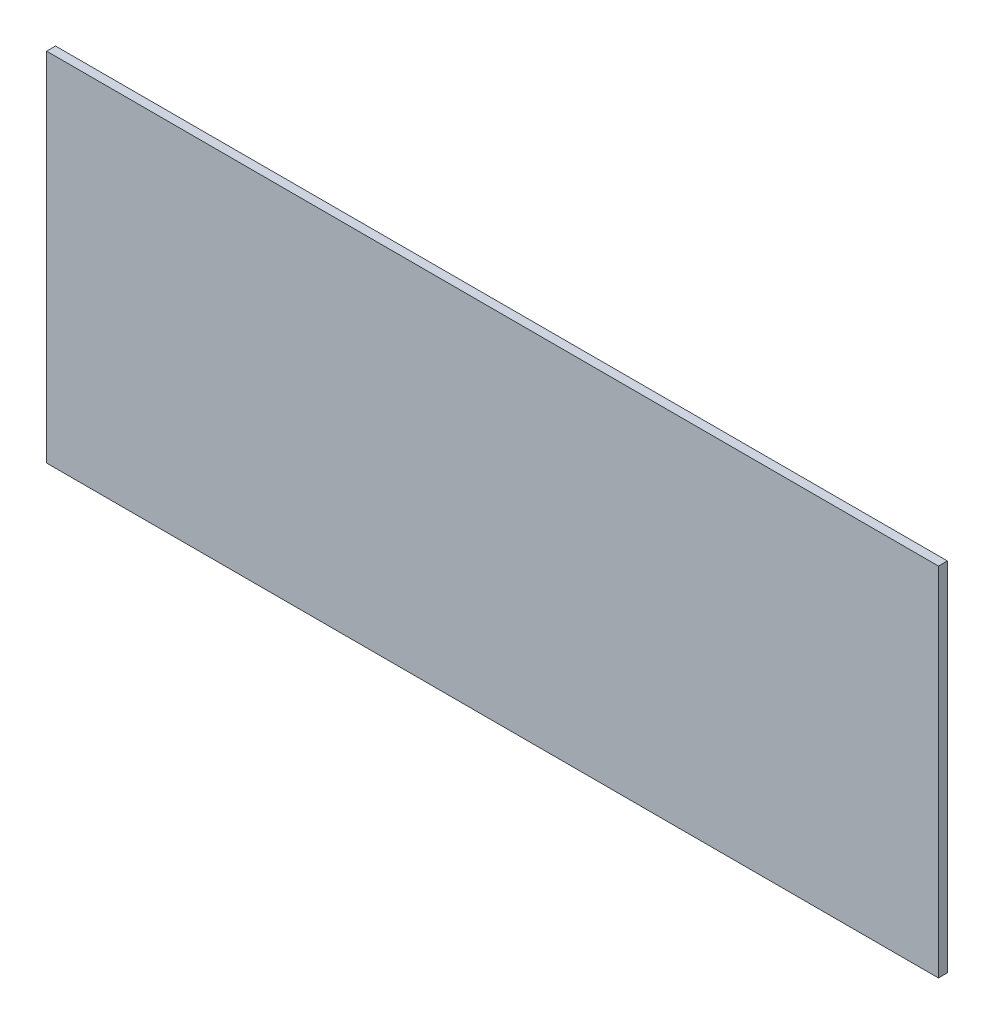
ISO-10303-21;
HEADER;
FILE_DESCRIPTION(('STEP AP214'),'2;1');
FILE_NAME('part.step','',(''),(''),'','','');
FILE_SCHEMA(('AUTOMOTIVE_DESIGN { 1 0 10303 214 1 1 1 1 }'));
ENDSEC;
DATA;
#1=APPLICATION_CONTEXT('core data for automotive mechanical design processes');
#2=APPLICATION_PROTOCOL_DEFINITION('international standard','automotive_design',2000,#1);
#3=PRODUCT_CONTEXT('',#1,'mechanical');
#4=PRODUCT('Part','Part','',(#3));
#5=PRODUCT_RELATED_PRODUCT_CATEGORY('part','',(#4));
#6=PRODUCT_DEFINITION_FORMATION('','',#4);
#7=PRODUCT_DEFINITION_CONTEXT('part definition',#1,'design');
#8=PRODUCT_DEFINITION('design','',#6,#7);
#9=PRODUCT_DEFINITION_SHAPE('','',#8);
#10=(LENGTH_UNIT() NAMED_UNIT(*) SI_UNIT(.MILLI.,.METRE.));
#11=(NAMED_UNIT(*) PLANE_ANGLE_UNIT() SI_UNIT($,.RADIAN.));
#12=(NAMED_UNIT(*) SI_UNIT($,.STERADIAN.) SOLID_ANGLE_UNIT());
#13=UNCERTAINTY_MEASURE_WITH_UNIT(LENGTH_MEASURE(1.E-05),#10,'distance_accuracy_value','');
#14=(GEOMETRIC_REPRESENTATION_CONTEXT(3) GLOBAL_UNCERTAINTY_ASSIGNED_CONTEXT((#13)) GLOBAL_UNIT_ASSIGNED_CONTEXT((#10,
#11,#12)) REPRESENTATION_CONTEXT('',''));
#15=CARTESIAN_POINT('',(0.,0.,0.));
#16=DIRECTION('',(0.,0.,1.));
#17=DIRECTION('',(1.,0.,0.));
#18=AXIS2_PLACEMENT_3D('',#15,#16,#17);
#19=CARTESIAN_POINT('',(0.,0.,3.));
#20=DIRECTION('',(1.,0.,0.));
#21=DIRECTION('',(0.,0.,-1.));
#22=AXIS2_PLACEMENT_3D('',#19,#20,#21);
#23=PLANE('',#22);
#24=DIRECTION('',(0.,-1.,0.));
#25=VECTOR('',#24,1.);
#26=CARTESIAN_POINT('',(0.,0.,0.));
#27=LINE('',#26,#25);
#28=CARTESIAN_POINT('',(0.,120.,0.));
#29=VERTEX_POINT('',#28);
#30=CARTESIAN_POINT('',(0.,0.,0.));
#31=VERTEX_POINT('',#30);
#32=EDGE_CURVE('E107',#29,#31,#27,.T.);
#33=ORIENTED_EDGE('',*,*,#32,.T.);
#34=DIRECTION('',(0.,0.,-1.));
#35=VECTOR('',#34,1.);
#36=CARTESIAN_POINT('',(0.,0.,3.));
#37=LINE('',#36,#35);
#38=CARTESIAN_POINT('',(0.,0.,3.));
#39=VERTEX_POINT('',#38);
#40=EDGE_CURVE('E11',#39,#31,#37,.T.);
#41=ORIENTED_EDGE('',*,*,#40,.F.);
#42=DIRECTION('',(0.,-1.,0.));
#43=VECTOR('',#42,1.);
#44=CARTESIAN_POINT('',(0.,0.,3.));
#45=LINE('',#44,#43);
#46=CARTESIAN_POINT('',(0.,120.,3.));
#47=VERTEX_POINT('',#46);
#48=EDGE_CURVE('E91',#47,#39,#45,.T.);
#49=ORIENTED_EDGE('',*,*,#48,.F.);
#50=DIRECTION('',(0.,0.,-1.));
#51=VECTOR('',#50,1.);
#52=CARTESIAN_POINT('',(0.,120.,3.));
#53=LINE('',#52,#51);
#54=EDGE_CURVE('E103',#47,#29,#53,.T.);
#55=ORIENTED_EDGE('',*,*,#54,.T.);
#56=EDGE_LOOP('',(#33,#41,#49,#55));
#57=FACE_BOUND('',#56,.T.);
#58=ADVANCED_FACE('F39',(#57),#23,.F.);
#59=CARTESIAN_POINT('',(0.,0.,3.));
#60=DIRECTION('',(0.,1.,0.));
#61=DIRECTION('',(0.,0.,1.));
#62=AXIS2_PLACEMENT_3D('',#59,#60,#61);
#63=PLANE('',#62);
#64=DIRECTION('',(1.,0.,0.));
#65=VECTOR('',#64,1.);
#66=CARTESIAN_POINT('',(0.,0.,0.));
#67=LINE('',#66,#65);
#68=CARTESIAN_POINT('',(300.,0.,0.));
#69=VERTEX_POINT('',#68);
#70=EDGE_CURVE('E96',#31,#69,#67,.T.);
#71=ORIENTED_EDGE('',*,*,#70,.T.);
#72=DIRECTION('',(0.,0.,-1.));
#73=VECTOR('',#72,1.);
#74=CARTESIAN_POINT('',(300.,0.,3.));
#75=LINE('',#74,#73);
#76=CARTESIAN_POINT('',(300.,0.,3.));
#77=VERTEX_POINT('',#76);
#78=EDGE_CURVE('E48',#77,#69,#75,.T.);
#79=ORIENTED_EDGE('',*,*,#78,.F.);
#80=DIRECTION('',(1.,0.,0.));
#81=VECTOR('',#80,1.);
#82=CARTESIAN_POINT('',(0.,0.,3.));
#83=LINE('',#82,#81);
#84=EDGE_CURVE('E86',#39,#77,#83,.T.);
#85=ORIENTED_EDGE('',*,*,#84,.F.);
#86=ORIENTED_EDGE('',*,*,#40,.T.);
#87=EDGE_LOOP('',(#71,#79,#85,#86));
#88=FACE_BOUND('',#87,.T.);
#89=ADVANCED_FACE('F95',(#88),#63,.F.);
#90=CARTESIAN_POINT('',(300.,0.,3.));
#91=DIRECTION('',(-1.,0.,0.));
#92=DIRECTION('',(0.,0.,1.));
#93=AXIS2_PLACEMENT_3D('',#90,#91,#92);
#94=PLANE('',#93);
#95=DIRECTION('',(0.,1.,0.));
#96=VECTOR('',#95,1.);
#97=CARTESIAN_POINT('',(300.,0.,0.));
#98=LINE('',#97,#96);
#99=CARTESIAN_POINT('',(300.,120.,0.));
#100=VERTEX_POINT('',#99);
#101=EDGE_CURVE('E73',#69,#100,#98,.T.);
#102=ORIENTED_EDGE('',*,*,#101,.T.);
#103=DIRECTION('',(0.,0.,-1.));
#104=VECTOR('',#103,1.);
#105=CARTESIAN_POINT('',(300.,120.,3.));
#106=LINE('',#105,#104);
#107=CARTESIAN_POINT('',(300.,120.,3.));
#108=VERTEX_POINT('',#107);
#109=EDGE_CURVE('E98',#108,#100,#106,.T.);
#110=ORIENTED_EDGE('',*,*,#109,.F.);
#111=DIRECTION('',(0.,1.,0.));
#112=VECTOR('',#111,1.);
#113=CARTESIAN_POINT('',(300.,0.,3.));
#114=LINE('',#113,#112);
#115=EDGE_CURVE('E89',#77,#108,#114,.T.);
#116=ORIENTED_EDGE('',*,*,#115,.F.);
#117=ORIENTED_EDGE('',*,*,#78,.T.);
#118=EDGE_LOOP('',(#102,#110,#116,#117));
#119=FACE_BOUND('',#118,.T.);
#120=ADVANCED_FACE('F99',(#119),#94,.F.);
#121=CARTESIAN_POINT('',(0.,120.,3.));
#122=DIRECTION('',(0.,-1.,0.));
#123=DIRECTION('',(0.,0.,-1.));
#124=AXIS2_PLACEMENT_3D('',#121,#122,#123);
#125=PLANE('',#124);
#126=DIRECTION('',(-1.,0.,0.));
#127=VECTOR('',#126,1.);
#128=CARTESIAN_POINT('',(0.,120.,0.));
#129=LINE('',#128,#127);
#130=EDGE_CURVE('E79',#100,#29,#129,.T.);
#131=ORIENTED_EDGE('',*,*,#130,.T.);
#132=ORIENTED_EDGE('',*,*,#54,.F.);
#133=DIRECTION('',(-1.,0.,0.));
#134=VECTOR('',#133,1.);
#135=CARTESIAN_POINT('',(0.,120.,3.));
#136=LINE('',#135,#134);
#137=EDGE_CURVE('E56',#108,#47,#136,.T.);
#138=ORIENTED_EDGE('',*,*,#137,.F.);
#139=ORIENTED_EDGE('',*,*,#109,.T.);
#140=EDGE_LOOP('',(#131,#132,#138,#139));
#141=FACE_BOUND('',#140,.T.);
#142=ADVANCED_FACE('F120',(#141),#125,.F.);
#143=CARTESIAN_POINT('',(0.,0.,3.));
#144=DIRECTION('',(0.,0.,-1.));
#145=DIRECTION('',(-1.,0.,0.));
#146=AXIS2_PLACEMENT_3D('',#143,#144,#145);
#147=PLANE('',#146);
#148=ORIENTED_EDGE('',*,*,#48,.T.);
#149=ORIENTED_EDGE('',*,*,#84,.T.);
#150=ORIENTED_EDGE('',*,*,#115,.T.);
#151=ORIENTED_EDGE('',*,*,#137,.T.);
#152=EDGE_LOOP('',(#148,#149,#150,#151));
#153=FACE_BOUND('',#152,.T.);
#154=ADVANCED_FACE('F87',(#153),#147,.F.);
#155=CARTESIAN_POINT('',(0.,0.,0.));
#156=DIRECTION('',(0.,0.,-1.));
#157=DIRECTION('',(-1.,0.,0.));
#158=AXIS2_PLACEMENT_3D('',#155,#156,#157);
#159=PLANE('',#158);
#160=ORIENTED_EDGE('',*,*,#32,.F.);
#161=ORIENTED_EDGE('',*,*,#130,.F.);
#162=ORIENTED_EDGE('',*,*,#101,.F.);
#163=ORIENTED_EDGE('',*,*,#70,.F.);
#164=EDGE_LOOP('',(#160,#161,#162,#163));
#165=FACE_BOUND('',#164,.T.);
#166=ADVANCED_FACE('F123',(#165),#159,.T.);
#167=CLOSED_SHELL('',(#58,#89,#120,#142,#154,#166));
#168=MANIFOLD_SOLID_BREP('B2',#167);
#169=ADVANCED_BREP_SHAPE_REPRESENTATION('',(#18,#168),#14);
#170=SHAPE_DEFINITION_REPRESENTATION(#9,#169);
ENDSEC;
END-ISO-10303-21;
